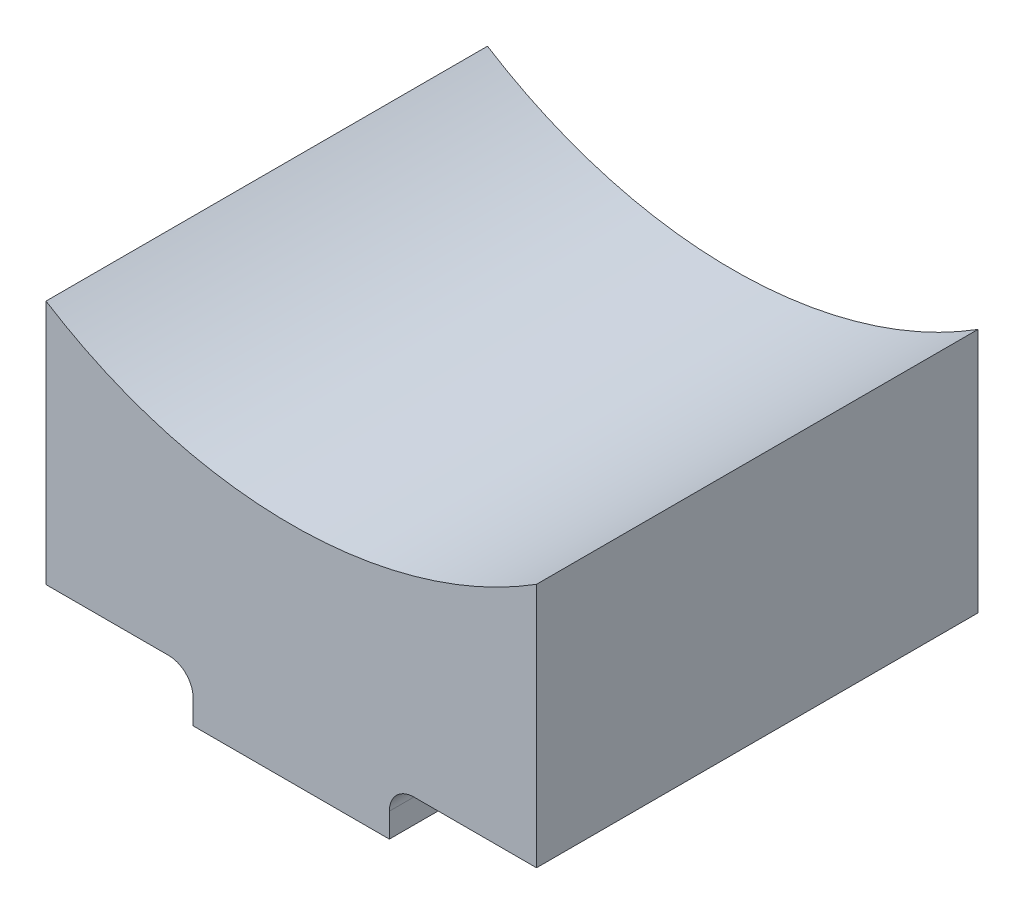
ISO-10303-21;
HEADER;
FILE_DESCRIPTION(('STEP AP214'),'2;1');
FILE_NAME('part.step','',(''),(''),'','','');
FILE_SCHEMA(('AUTOMOTIVE_DESIGN { 1 0 10303 214 1 1 1 1 }'));
ENDSEC;
DATA;
#1=APPLICATION_CONTEXT('core data for automotive mechanical design processes');
#2=APPLICATION_PROTOCOL_DEFINITION('international standard','automotive_design',2000,#1);
#3=PRODUCT_CONTEXT('',#1,'mechanical');
#4=PRODUCT('Part','Part','',(#3));
#5=PRODUCT_RELATED_PRODUCT_CATEGORY('part','',(#4));
#6=PRODUCT_DEFINITION_FORMATION('','',#4);
#7=PRODUCT_DEFINITION_CONTEXT('part definition',#1,'design');
#8=PRODUCT_DEFINITION('design','',#6,#7);
#9=PRODUCT_DEFINITION_SHAPE('','',#8);
#10=(LENGTH_UNIT() NAMED_UNIT(*) SI_UNIT(.MILLI.,.METRE.));
#11=(NAMED_UNIT(*) PLANE_ANGLE_UNIT() SI_UNIT($,.RADIAN.));
#12=(NAMED_UNIT(*) SI_UNIT($,.STERADIAN.) SOLID_ANGLE_UNIT());
#13=UNCERTAINTY_MEASURE_WITH_UNIT(LENGTH_MEASURE(1.E-05),#10,'distance_accuracy_value','');
#14=(GEOMETRIC_REPRESENTATION_CONTEXT(3) GLOBAL_UNCERTAINTY_ASSIGNED_CONTEXT((#13)) GLOBAL_UNIT_ASSIGNED_CONTEXT((#10,
#11,#12)) REPRESENTATION_CONTEXT('',''));
#15=CARTESIAN_POINT('',(0.,0.,0.));
#16=DIRECTION('',(0.,0.,1.));
#17=DIRECTION('',(1.,0.,0.));
#18=AXIS2_PLACEMENT_3D('',#15,#16,#17);
#19=CARTESIAN_POINT('',(-10.,3.99284930146803,9.));
#20=DIRECTION('',(1.,0.,0.));
#21=DIRECTION('',(0.,0.,-1.));
#22=AXIS2_PLACEMENT_3D('',#19,#20,#21);
#23=PLANE('',#22);
#24=DIRECTION('',(0.,-1.,0.));
#25=VECTOR('',#24,1.);
#26=CARTESIAN_POINT('',(-10.,3.99284930146803,-9.));
#27=LINE('',#26,#25);
#28=CARTESIAN_POINT('',(-10.,3.99284930146803,-9.));
#29=VERTEX_POINT('',#28);
#30=CARTESIAN_POINT('',(-10.,-6.01853915978745,-9.));
#31=VERTEX_POINT('',#30);
#32=EDGE_CURVE('E142',#29,#31,#27,.T.);
#33=ORIENTED_EDGE('',*,*,#32,.T.);
#34=DIRECTION('',(0.,0.,-1.));
#35=VECTOR('',#34,1.);
#36=CARTESIAN_POINT('',(-10.,-6.01853915978745,9.));
#37=LINE('',#36,#35);
#38=CARTESIAN_POINT('',(-10.,-6.01853915978745,9.));
#39=VERTEX_POINT('',#38);
#40=EDGE_CURVE('E11',#39,#31,#37,.T.);
#41=ORIENTED_EDGE('',*,*,#40,.F.);
#42=DIRECTION('',(0.,-1.,0.));
#43=VECTOR('',#42,1.);
#44=CARTESIAN_POINT('',(-10.,3.99284930146803,9.));
#45=LINE('',#44,#43);
#46=CARTESIAN_POINT('',(-10.,3.99284930146803,9.));
#47=VERTEX_POINT('',#46);
#48=EDGE_CURVE('E167',#47,#39,#45,.T.);
#49=ORIENTED_EDGE('',*,*,#48,.F.);
#50=DIRECTION('',(0.,0.,-1.));
#51=VECTOR('',#50,1.);
#52=CARTESIAN_POINT('',(-10.,3.99284930146803,9.));
#53=LINE('',#52,#51);
#54=EDGE_CURVE('E49',#47,#29,#53,.T.);
#55=ORIENTED_EDGE('',*,*,#54,.T.);
#56=EDGE_LOOP('',(#33,#41,#49,#55));
#57=FACE_BOUND('',#56,.T.);
#58=ADVANCED_FACE('F33',(#57),#23,.F.);
#59=CARTESIAN_POINT('',(-10.,-6.01853915978745,9.));
#60=DIRECTION('',(0.,1.,0.));
#61=DIRECTION('',(-1.,0.,0.));
#62=AXIS2_PLACEMENT_3D('',#59,#60,#61);
#63=PLANE('',#62);
#64=DIRECTION('',(1.,0.,0.));
#65=VECTOR('',#64,1.);
#66=CARTESIAN_POINT('',(-10.,-6.01853915978745,-9.));
#67=LINE('',#66,#65);
#68=CARTESIAN_POINT('',(-5.,-6.01853915978745,-9.));
#69=VERTEX_POINT('',#68);
#70=EDGE_CURVE('E144',#31,#69,#67,.T.);
#71=ORIENTED_EDGE('',*,*,#70,.T.);
#72=DIRECTION('',(0.,0.,-1.));
#73=VECTOR('',#72,1.);
#74=CARTESIAN_POINT('',(-5.,-6.01853915978745,9.));
#75=LINE('',#74,#73);
#76=CARTESIAN_POINT('',(-5.,-6.01853915978745,9.));
#77=VERTEX_POINT('',#76);
#78=EDGE_CURVE('E41',#77,#69,#75,.T.);
#79=ORIENTED_EDGE('',*,*,#78,.F.);
#80=DIRECTION('',(1.,0.,0.));
#81=VECTOR('',#80,1.);
#82=CARTESIAN_POINT('',(-10.,-6.01853915978745,9.));
#83=LINE('',#82,#81);
#84=EDGE_CURVE('E93',#39,#77,#83,.T.);
#85=ORIENTED_EDGE('',*,*,#84,.F.);
#86=ORIENTED_EDGE('',*,*,#40,.T.);
#87=EDGE_LOOP('',(#71,#79,#85,#86));
#88=FACE_BOUND('',#87,.T.);
#89=ADVANCED_FACE('F185',(#88),#63,.F.);
#90=CARTESIAN_POINT('',(-5.,-7.01853915978746,9.));
#91=DIRECTION('',(0.,0.,-1.));
#92=DIRECTION('',(-1.,0.,0.));
#93=AXIS2_PLACEMENT_3D('',#90,#91,#92);
#94=CYLINDRICAL_SURFACE('',#93,1.00000000000001);
#95=CARTESIAN_POINT('',(-5.,-7.01853915978746,-9.));
#96=DIRECTION('',(0.,0.,1.));
#97=DIRECTION('',(1.,0.,0.));
#98=AXIS2_PLACEMENT_3D('',#95,#96,#97);
#99=CIRCLE('',#98,1.00000000000001);
#100=CARTESIAN_POINT('',(-3.99999999999999,-7.01853915978746,-9.));
#101=VERTEX_POINT('',#100);
#102=EDGE_CURVE('E147',#101,#69,#99,.T.);
#103=ORIENTED_EDGE('',*,*,#102,.F.);
#104=DIRECTION('',(0.,0.,-1.));
#105=VECTOR('',#104,1.);
#106=CARTESIAN_POINT('',(-3.99999999999999,-7.01853915978746,9.));
#107=LINE('',#106,#105);
#108=CARTESIAN_POINT('',(-3.99999999999999,-7.01853915978746,9.));
#109=VERTEX_POINT('',#108);
#110=EDGE_CURVE('E178',#109,#101,#107,.T.);
#111=ORIENTED_EDGE('',*,*,#110,.F.);
#112=CARTESIAN_POINT('',(-5.,-7.01853915978746,9.));
#113=DIRECTION('',(0.,0.,1.));
#114=DIRECTION('',(1.,0.,0.));
#115=AXIS2_PLACEMENT_3D('',#112,#113,#114);
#116=CIRCLE('',#115,1.00000000000001);
#117=EDGE_CURVE('E184',#109,#77,#116,.T.);
#118=ORIENTED_EDGE('',*,*,#117,.T.);
#119=ORIENTED_EDGE('',*,*,#78,.T.);
#120=EDGE_LOOP('',(#103,#111,#118,#119));
#121=FACE_BOUND('',#120,.T.);
#122=ADVANCED_FACE('F182',(#121),#94,.F.);
#123=CARTESIAN_POINT('',(-3.99999999999999,-7.01853915978746,9.));
#124=DIRECTION('',(1.,0.,0.));
#125=DIRECTION('',(0.,0.,-1.));
#126=AXIS2_PLACEMENT_3D('',#123,#124,#125);
#127=PLANE('',#126);
#128=DIRECTION('',(0.,-1.,0.));
#129=VECTOR('',#128,1.);
#130=CARTESIAN_POINT('',(-3.99999999999999,-7.01853915978746,-9.));
#131=LINE('',#130,#129);
#132=CARTESIAN_POINT('',(-3.99999999999999,-8.00715069853197,-9.));
#133=VERTEX_POINT('',#132);
#134=EDGE_CURVE('E150',#101,#133,#131,.T.);
#135=ORIENTED_EDGE('',*,*,#134,.T.);
#136=DIRECTION('',(0.,0.,-1.));
#137=VECTOR('',#136,1.);
#138=CARTESIAN_POINT('',(-3.99999999999999,-8.00715069853197,9.));
#139=LINE('',#138,#137);
#140=CARTESIAN_POINT('',(-3.99999999999999,-8.00715069853197,9.));
#141=VERTEX_POINT('',#140);
#142=EDGE_CURVE('E175',#141,#133,#139,.T.);
#143=ORIENTED_EDGE('',*,*,#142,.F.);
#144=DIRECTION('',(0.,-1.,0.));
#145=VECTOR('',#144,1.);
#146=CARTESIAN_POINT('',(-3.99999999999999,-7.01853915978746,9.));
#147=LINE('',#146,#145);
#148=EDGE_CURVE('E202',#109,#141,#147,.T.);
#149=ORIENTED_EDGE('',*,*,#148,.F.);
#150=ORIENTED_EDGE('',*,*,#110,.T.);
#151=EDGE_LOOP('',(#135,#143,#149,#150));
#152=FACE_BOUND('',#151,.T.);
#153=ADVANCED_FACE('F193',(#152),#127,.F.);
#154=CARTESIAN_POINT('',(-3.99999999999999,-8.00715069853197,9.));
#155=DIRECTION('',(0.,1.,0.));
#156=DIRECTION('',(0.,0.,1.));
#157=AXIS2_PLACEMENT_3D('',#154,#155,#156);
#158=PLANE('',#157);
#159=DIRECTION('',(1.,0.,0.));
#160=VECTOR('',#159,1.);
#161=CARTESIAN_POINT('',(-3.99999999999999,-8.00715069853197,-9.));
#162=LINE('',#161,#160);
#163=CARTESIAN_POINT('',(3.99999999999999,-8.00715069853197,-9.));
#164=VERTEX_POINT('',#163);
#165=EDGE_CURVE('E152',#133,#164,#162,.T.);
#166=ORIENTED_EDGE('',*,*,#165,.T.);
#167=DIRECTION('',(0.,0.,-1.));
#168=VECTOR('',#167,1.);
#169=CARTESIAN_POINT('',(3.99999999999999,-8.00715069853197,9.));
#170=LINE('',#169,#168);
#171=CARTESIAN_POINT('',(3.99999999999999,-8.00715069853197,9.));
#172=VERTEX_POINT('',#171);
#173=EDGE_CURVE('E173',#172,#164,#170,.T.);
#174=ORIENTED_EDGE('',*,*,#173,.F.);
#175=DIRECTION('',(1.,0.,0.));
#176=VECTOR('',#175,1.);
#177=CARTESIAN_POINT('',(-3.99999999999999,-8.00715069853197,9.));
#178=LINE('',#177,#176);
#179=EDGE_CURVE('E199',#141,#172,#178,.T.);
#180=ORIENTED_EDGE('',*,*,#179,.F.);
#181=ORIENTED_EDGE('',*,*,#142,.T.);
#182=EDGE_LOOP('',(#166,#174,#180,#181));
#183=FACE_BOUND('',#182,.T.);
#184=ADVANCED_FACE('F197',(#183),#158,.F.);
#185=CARTESIAN_POINT('',(3.99999999999999,-7.01853915978746,9.));
#186=DIRECTION('',(1.,0.,0.));
#187=DIRECTION('',(0.,0.,-1.));
#188=AXIS2_PLACEMENT_3D('',#185,#186,#187);
#189=PLANE('',#188);
#190=DIRECTION('',(0.,-1.,0.));
#191=VECTOR('',#190,1.);
#192=CARTESIAN_POINT('',(3.99999999999999,-7.01853915978746,-9.));
#193=LINE('',#192,#191);
#194=CARTESIAN_POINT('',(3.99999999999999,-7.01853915978746,-9.));
#195=VERTEX_POINT('',#194);
#196=EDGE_CURVE('E155',#195,#164,#193,.T.);
#197=ORIENTED_EDGE('',*,*,#196,.F.);
#198=DIRECTION('',(0.,0.,-1.));
#199=VECTOR('',#198,1.);
#200=CARTESIAN_POINT('',(3.99999999999999,-7.01853915978746,9.));
#201=LINE('',#200,#199);
#202=CARTESIAN_POINT('',(3.99999999999999,-7.01853915978746,9.));
#203=VERTEX_POINT('',#202);
#204=EDGE_CURVE('E171',#203,#195,#201,.T.);
#205=ORIENTED_EDGE('',*,*,#204,.F.);
#206=DIRECTION('',(0.,-1.,0.));
#207=VECTOR('',#206,1.);
#208=CARTESIAN_POINT('',(3.99999999999999,-7.01853915978746,9.));
#209=LINE('',#208,#207);
#210=EDGE_CURVE('E201',#203,#172,#209,.T.);
#211=ORIENTED_EDGE('',*,*,#210,.T.);
#212=ORIENTED_EDGE('',*,*,#173,.T.);
#213=EDGE_LOOP('',(#197,#205,#211,#212));
#214=FACE_BOUND('',#213,.T.);
#215=ADVANCED_FACE('F232',(#214),#189,.T.);
#216=CARTESIAN_POINT('',(5.,-7.01853915978746,9.));
#217=DIRECTION('',(0.,0.,-1.));
#218=DIRECTION('',(-1.,0.,0.));
#219=AXIS2_PLACEMENT_3D('',#216,#217,#218);
#220=CYLINDRICAL_SURFACE('',#219,1.00000000000001);
#221=CARTESIAN_POINT('',(5.,-7.01853915978746,-9.));
#222=DIRECTION('',(0.,0.,-1.));
#223=DIRECTION('',(-1.,0.,0.));
#224=AXIS2_PLACEMENT_3D('',#221,#222,#223);
#225=CIRCLE('',#224,1.00000000000001);
#226=CARTESIAN_POINT('',(5.,-6.01853915978745,-9.));
#227=VERTEX_POINT('',#226);
#228=EDGE_CURVE('E158',#195,#227,#225,.T.);
#229=ORIENTED_EDGE('',*,*,#228,.T.);
#230=DIRECTION('',(0.,0.,-1.));
#231=VECTOR('',#230,1.);
#232=CARTESIAN_POINT('',(5.,-6.01853915978745,9.));
#233=LINE('',#232,#231);
#234=CARTESIAN_POINT('',(5.,-6.01853915978745,9.));
#235=VERTEX_POINT('',#234);
#236=EDGE_CURVE('E124',#235,#227,#233,.T.);
#237=ORIENTED_EDGE('',*,*,#236,.F.);
#238=CARTESIAN_POINT('',(5.,-7.01853915978746,9.));
#239=DIRECTION('',(0.,0.,-1.));
#240=DIRECTION('',(-1.,0.,0.));
#241=AXIS2_PLACEMENT_3D('',#238,#239,#240);
#242=CIRCLE('',#241,1.00000000000001);
#243=EDGE_CURVE('E133',#203,#235,#242,.T.);
#244=ORIENTED_EDGE('',*,*,#243,.F.);
#245=ORIENTED_EDGE('',*,*,#204,.T.);
#246=EDGE_LOOP('',(#229,#237,#244,#245));
#247=FACE_BOUND('',#246,.T.);
#248=ADVANCED_FACE('F235',(#247),#220,.F.);
#249=CARTESIAN_POINT('',(10.,-6.01853915978745,9.));
#250=DIRECTION('',(0.,-1.,0.));
#251=DIRECTION('',(1.,0.,0.));
#252=AXIS2_PLACEMENT_3D('',#249,#250,#251);
#253=PLANE('',#252);
#254=DIRECTION('',(-1.,0.,0.));
#255=VECTOR('',#254,1.);
#256=CARTESIAN_POINT('',(10.,-6.01853915978745,-9.));
#257=LINE('',#256,#255);
#258=CARTESIAN_POINT('',(10.,-6.01853915978745,-9.));
#259=VERTEX_POINT('',#258);
#260=EDGE_CURVE('E120',#259,#227,#257,.T.);
#261=ORIENTED_EDGE('',*,*,#260,.F.);
#262=DIRECTION('',(0.,0.,-1.));
#263=VECTOR('',#262,1.);
#264=CARTESIAN_POINT('',(10.,-6.01853915978745,9.));
#265=LINE('',#264,#263);
#266=CARTESIAN_POINT('',(10.,-6.01853915978745,9.));
#267=VERTEX_POINT('',#266);
#268=EDGE_CURVE('E115',#267,#259,#265,.T.);
#269=ORIENTED_EDGE('',*,*,#268,.F.);
#270=DIRECTION('',(-1.,0.,0.));
#271=VECTOR('',#270,1.);
#272=CARTESIAN_POINT('',(10.,-6.01853915978745,9.));
#273=LINE('',#272,#271);
#274=EDGE_CURVE('E118',#267,#235,#273,.T.);
#275=ORIENTED_EDGE('',*,*,#274,.T.);
#276=ORIENTED_EDGE('',*,*,#236,.T.);
#277=EDGE_LOOP('',(#261,#269,#275,#276));
#278=FACE_BOUND('',#277,.T.);
#279=ADVANCED_FACE('F117',(#278),#253,.T.);
#280=CARTESIAN_POINT('',(10.,3.99284930146803,9.));
#281=DIRECTION('',(1.,0.,0.));
#282=DIRECTION('',(0.,0.,-1.));
#283=AXIS2_PLACEMENT_3D('',#280,#281,#282);
#284=PLANE('',#283);
#285=DIRECTION('',(0.,-1.,0.));
#286=VECTOR('',#285,1.);
#287=CARTESIAN_POINT('',(10.,3.99284930146803,-9.));
#288=LINE('',#287,#286);
#289=CARTESIAN_POINT('',(10.,3.99284930146803,-9.));
#290=VERTEX_POINT('',#289);
#291=EDGE_CURVE('E162',#290,#259,#288,.T.);
#292=ORIENTED_EDGE('',*,*,#291,.F.);
#293=DIRECTION('',(0.,0.,-1.));
#294=VECTOR('',#293,1.);
#295=CARTESIAN_POINT('',(10.,3.99284930146803,9.));
#296=LINE('',#295,#294);
#297=CARTESIAN_POINT('',(10.,3.99284930146803,9.));
#298=VERTEX_POINT('',#297);
#299=EDGE_CURVE('E81',#298,#290,#296,.T.);
#300=ORIENTED_EDGE('',*,*,#299,.F.);
#301=DIRECTION('',(0.,-1.,0.));
#302=VECTOR('',#301,1.);
#303=CARTESIAN_POINT('',(10.,3.99284930146803,9.));
#304=LINE('',#303,#302);
#305=EDGE_CURVE('E130',#298,#267,#304,.T.);
#306=ORIENTED_EDGE('',*,*,#305,.T.);
#307=ORIENTED_EDGE('',*,*,#268,.T.);
#308=EDGE_LOOP('',(#292,#300,#306,#307));
#309=FACE_BOUND('',#308,.T.);
#310=ADVANCED_FACE('F136',(#309),#284,.T.);
#311=CARTESIAN_POINT('',(0.,19.8337334854649,9.));
#312=DIRECTION('',(0.,0.,-1.));
#313=DIRECTION('',(-1.,0.,0.));
#314=AXIS2_PLACEMENT_3D('',#311,#312,#313);
#315=CYLINDRICAL_SURFACE('',#314,18.7332221395787);
#316=CARTESIAN_POINT('',(0.,19.8337334854649,-9.));
#317=DIRECTION('',(0.,0.,1.));
#318=DIRECTION('',(1.,0.,0.));
#319=AXIS2_PLACEMENT_3D('',#316,#317,#318);
#320=CIRCLE('',#319,18.7332221395787);
#321=EDGE_CURVE('E164',#29,#290,#320,.T.);
#322=ORIENTED_EDGE('',*,*,#321,.F.);
#323=ORIENTED_EDGE('',*,*,#54,.F.);
#324=CARTESIAN_POINT('',(0.,19.8337334854649,9.));
#325=DIRECTION('',(0.,0.,1.));
#326=DIRECTION('',(1.,0.,0.));
#327=AXIS2_PLACEMENT_3D('',#324,#325,#326);
#328=CIRCLE('',#327,18.7332221395787);
#329=EDGE_CURVE('E137',#47,#298,#328,.T.);
#330=ORIENTED_EDGE('',*,*,#329,.T.);
#331=ORIENTED_EDGE('',*,*,#299,.T.);
#332=EDGE_LOOP('',(#322,#323,#330,#331));
#333=FACE_BOUND('',#332,.T.);
#334=ADVANCED_FACE('F209',(#333),#315,.F.);
#335=CARTESIAN_POINT('',(-5.,-7.01853915978746,9.));
#336=DIRECTION('',(0.,0.,1.));
#337=DIRECTION('',(1.,0.,0.));
#338=AXIS2_PLACEMENT_3D('',#335,#336,#337);
#339=PLANE('',#338);
#340=ORIENTED_EDGE('',*,*,#48,.T.);
#341=ORIENTED_EDGE('',*,*,#84,.T.);
#342=ORIENTED_EDGE('',*,*,#117,.F.);
#343=ORIENTED_EDGE('',*,*,#148,.T.);
#344=ORIENTED_EDGE('',*,*,#179,.T.);
#345=ORIENTED_EDGE('',*,*,#210,.F.);
#346=ORIENTED_EDGE('',*,*,#243,.T.);
#347=ORIENTED_EDGE('',*,*,#274,.F.);
#348=ORIENTED_EDGE('',*,*,#305,.F.);
#349=ORIENTED_EDGE('',*,*,#329,.F.);
#350=EDGE_LOOP('',(#340,#341,#342,#343,#344,#345,#346,#347,#348,#349));
#351=FACE_BOUND('',#350,.T.);
#352=ADVANCED_FACE('F128',(#351),#339,.T.);
#353=CARTESIAN_POINT('',(-5.,-7.01853915978746,-9.));
#354=DIRECTION('',(0.,0.,1.));
#355=DIRECTION('',(1.,0.,0.));
#356=AXIS2_PLACEMENT_3D('',#353,#354,#355);
#357=PLANE('',#356);
#358=ORIENTED_EDGE('',*,*,#32,.F.);
#359=ORIENTED_EDGE('',*,*,#321,.T.);
#360=ORIENTED_EDGE('',*,*,#291,.T.);
#361=ORIENTED_EDGE('',*,*,#260,.T.);
#362=ORIENTED_EDGE('',*,*,#228,.F.);
#363=ORIENTED_EDGE('',*,*,#196,.T.);
#364=ORIENTED_EDGE('',*,*,#165,.F.);
#365=ORIENTED_EDGE('',*,*,#134,.F.);
#366=ORIENTED_EDGE('',*,*,#102,.T.);
#367=ORIENTED_EDGE('',*,*,#70,.F.);
#368=EDGE_LOOP('',(#358,#359,#360,#361,#362,#363,#364,#365,#366,#367));
#369=FACE_BOUND('',#368,.T.);
#370=ADVANCED_FACE('F189',(#369),#357,.F.);
#371=CLOSED_SHELL('',(#58,#89,#122,#153,#184,#215,#248,#279,#310,#334,#352,#370));
#372=MANIFOLD_SOLID_BREP('B2',#371);
#373=ADVANCED_BREP_SHAPE_REPRESENTATION('',(#18,#372),#14);
#374=SHAPE_DEFINITION_REPRESENTATION(#9,#373);
ENDSEC;
END-ISO-10303-21;
